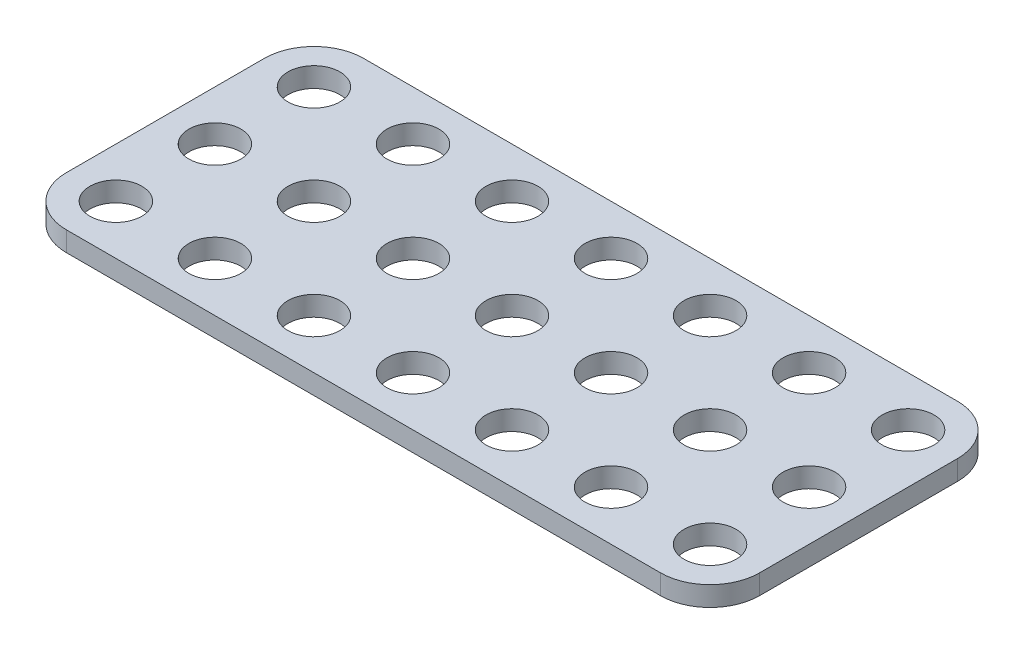
ISO-10303-21;
HEADER;
FILE_DESCRIPTION(('STEP AP214'),'2;1');
FILE_NAME('part.step','',(''),(''),'','','');
FILE_SCHEMA(('AUTOMOTIVE_DESIGN { 1 0 10303 214 1 1 1 1 }'));
ENDSEC;
DATA;
#1=APPLICATION_CONTEXT('core data for automotive mechanical design processes');
#2=APPLICATION_PROTOCOL_DEFINITION('international standard','automotive_design',2000,#1);
#3=PRODUCT_CONTEXT('',#1,'mechanical');
#4=PRODUCT('Part','Part','',(#3));
#5=PRODUCT_RELATED_PRODUCT_CATEGORY('part','',(#4));
#6=PRODUCT_DEFINITION_FORMATION('','',#4);
#7=PRODUCT_DEFINITION_CONTEXT('part definition',#1,'design');
#8=PRODUCT_DEFINITION('design','',#6,#7);
#9=PRODUCT_DEFINITION_SHAPE('','',#8);
#10=(LENGTH_UNIT() NAMED_UNIT(*) SI_UNIT(.MILLI.,.METRE.));
#11=(NAMED_UNIT(*) PLANE_ANGLE_UNIT() SI_UNIT($,.RADIAN.));
#12=(NAMED_UNIT(*) SI_UNIT($,.STERADIAN.) SOLID_ANGLE_UNIT());
#13=UNCERTAINTY_MEASURE_WITH_UNIT(LENGTH_MEASURE(1.E-05),#10,'distance_accuracy_value','');
#14=(GEOMETRIC_REPRESENTATION_CONTEXT(3) GLOBAL_UNCERTAINTY_ASSIGNED_CONTEXT((#13)) GLOBAL_UNIT_ASSIGNED_CONTEXT((#10,
#11,#12)) REPRESENTATION_CONTEXT('',''));
#15=CARTESIAN_POINT('',(0.,0.,0.));
#16=DIRECTION('',(0.,0.,1.));
#17=DIRECTION('',(1.,0.,0.));
#18=AXIS2_PLACEMENT_3D('',#15,#16,#17);
#19=CARTESIAN_POINT('',(0.,-1.6,-25.6));
#20=DIRECTION('',(0.,1.,0.));
#21=DIRECTION('',(0.,0.,1.));
#22=AXIS2_PLACEMENT_3D('',#19,#20,#21);
#23=PLANE('',#22);
#24=CARTESIAN_POINT('',(-44.8,-1.6,-4.79999999999999));
#25=DIRECTION('',(0.,1.,0.));
#26=DIRECTION('',(0.,0.,1.));
#27=AXIS2_PLACEMENT_3D('',#24,#25,#26);
#28=CIRCLE('',#27,2.09999999999999);
#29=CARTESIAN_POINT('',(-44.8,-1.6,-2.7));
#30=VERTEX_POINT('',#29);
#31=EDGE_CURVE('E112',#30,#30,#28,.T.);
#32=ORIENTED_EDGE('',*,*,#31,.T.);
#33=EDGE_LOOP('',(#32));
#34=FACE_BOUND('',#33,.T.);
#35=CARTESIAN_POINT('',(-52.8,-1.6,-4.79999999999999));
#36=DIRECTION('',(0.,1.,0.));
#37=DIRECTION('',(0.,0.,1.));
#38=AXIS2_PLACEMENT_3D('',#35,#36,#37);
#39=CIRCLE('',#38,2.09999999999999);
#40=CARTESIAN_POINT('',(-52.8,-1.6,-2.7));
#41=VERTEX_POINT('',#40);
#42=EDGE_CURVE('E202',#41,#41,#39,.T.);
#43=ORIENTED_EDGE('',*,*,#42,.T.);
#44=EDGE_LOOP('',(#43));
#45=FACE_BOUND('',#44,.T.);
#46=DIRECTION('',(-1.,0.,0.));
#47=VECTOR('',#46,1.);
#48=CARTESIAN_POINT('',(-56.8,-1.6,-0.8));
#49=LINE('',#48,#47);
#50=CARTESIAN_POINT('',(-4.80000000000001,-1.6,-0.799999999999999));
#51=VERTEX_POINT('',#50);
#52=CARTESIAN_POINT('',(-52.8,-1.6,-0.8));
#53=VERTEX_POINT('',#52);
#54=EDGE_CURVE('E82',#51,#53,#49,.T.);
#55=ORIENTED_EDGE('',*,*,#54,.T.);
#56=CARTESIAN_POINT('',(-52.8,-1.6,-4.8));
#57=DIRECTION('',(0.,1.,0.));
#58=DIRECTION('',(0.,0.,1.));
#59=AXIS2_PLACEMENT_3D('',#56,#57,#58);
#60=CIRCLE('',#59,4.);
#61=CARTESIAN_POINT('',(-56.8,-1.6,-4.8));
#62=VERTEX_POINT('',#61);
#63=EDGE_CURVE('E85',#62,#53,#60,.T.);
#64=ORIENTED_EDGE('',*,*,#63,.F.);
#65=DIRECTION('',(0.,0.,-1.));
#66=VECTOR('',#65,1.);
#67=CARTESIAN_POINT('',(-56.8,-1.6,0.));
#68=LINE('',#67,#66);
#69=CARTESIAN_POINT('',(-56.8,-1.6,-20.8));
#70=VERTEX_POINT('',#69);
#71=EDGE_CURVE('E77',#62,#70,#68,.T.);
#72=ORIENTED_EDGE('',*,*,#71,.T.);
#73=CARTESIAN_POINT('',(-52.8,-1.6,-20.8));
#74=DIRECTION('',(0.,1.,0.));
#75=DIRECTION('',(0.,0.,1.));
#76=AXIS2_PLACEMENT_3D('',#73,#74,#75);
#77=CIRCLE('',#76,4.);
#78=CARTESIAN_POINT('',(-52.8,-1.6,-24.8));
#79=VERTEX_POINT('',#78);
#80=EDGE_CURVE('E194',#79,#70,#77,.T.);
#81=ORIENTED_EDGE('',*,*,#80,.F.);
#82=DIRECTION('',(1.,0.,0.));
#83=VECTOR('',#82,1.);
#84=CARTESIAN_POINT('',(-56.8,-1.6,-24.8));
#85=LINE('',#84,#83);
#86=CARTESIAN_POINT('',(-4.8,-1.6,-24.8));
#87=VERTEX_POINT('',#86);
#88=EDGE_CURVE('E113',#79,#87,#85,.T.);
#89=ORIENTED_EDGE('',*,*,#88,.T.);
#90=CARTESIAN_POINT('',(-4.8,-1.6,-20.8));
#91=DIRECTION('',(0.,1.,0.));
#92=DIRECTION('',(0.,0.,1.));
#93=AXIS2_PLACEMENT_3D('',#90,#91,#92);
#94=CIRCLE('',#93,4.);
#95=CARTESIAN_POINT('',(-0.8,-1.6,-20.8));
#96=VERTEX_POINT('',#95);
#97=EDGE_CURVE('E116',#96,#87,#94,.T.);
#98=ORIENTED_EDGE('',*,*,#97,.F.);
#99=DIRECTION('',(0.,0.,1.));
#100=VECTOR('',#99,1.);
#101=CARTESIAN_POINT('',(-0.8,-1.6,-25.6));
#102=LINE('',#101,#100);
#103=CARTESIAN_POINT('',(-0.800000000000002,-1.6,-4.8));
#104=VERTEX_POINT('',#103);
#105=EDGE_CURVE('E117',#96,#104,#102,.T.);
#106=ORIENTED_EDGE('',*,*,#105,.T.);
#107=CARTESIAN_POINT('',(-4.8,-1.6,-4.8));
#108=DIRECTION('',(0.,-1.,0.));
#109=DIRECTION('',(0.,0.,-1.));
#110=AXIS2_PLACEMENT_3D('',#107,#108,#109);
#111=CIRCLE('',#110,4.);
#112=EDGE_CURVE('E88',#51,#104,#111,.F.);
#113=ORIENTED_EDGE('',*,*,#112,.F.);
#114=EDGE_LOOP('',(#55,#64,#72,#81,#89,#98,#106,#113));
#115=FACE_BOUND('',#114,.T.);
#116=CARTESIAN_POINT('',(-36.8,-1.6,-4.79999999999999));
#117=DIRECTION('',(0.,1.,0.));
#118=DIRECTION('',(0.,0.,1.));
#119=AXIS2_PLACEMENT_3D('',#116,#117,#118);
#120=CIRCLE('',#119,2.09999999999999);
#121=CARTESIAN_POINT('',(-36.8,-1.6,-2.7));
#122=VERTEX_POINT('',#121);
#123=EDGE_CURVE('E205',#122,#122,#120,.T.);
#124=ORIENTED_EDGE('',*,*,#123,.T.);
#125=EDGE_LOOP('',(#124));
#126=FACE_BOUND('',#125,.T.);
#127=CARTESIAN_POINT('',(-28.8,-1.6,-4.8));
#128=DIRECTION('',(0.,1.,0.));
#129=DIRECTION('',(0.,0.,1.));
#130=AXIS2_PLACEMENT_3D('',#127,#128,#129);
#131=CIRCLE('',#130,2.09999999999999);
#132=CARTESIAN_POINT('',(-28.8,-1.6,-2.70000000000001));
#133=VERTEX_POINT('',#132);
#134=EDGE_CURVE('E208',#133,#133,#131,.T.);
#135=ORIENTED_EDGE('',*,*,#134,.T.);
#136=EDGE_LOOP('',(#135));
#137=FACE_BOUND('',#136,.T.);
#138=CARTESIAN_POINT('',(-20.8,-1.6,-4.8));
#139=DIRECTION('',(0.,1.,0.));
#140=DIRECTION('',(0.,0.,1.));
#141=AXIS2_PLACEMENT_3D('',#138,#139,#140);
#142=CIRCLE('',#141,2.09999999999999);
#143=CARTESIAN_POINT('',(-20.8,-1.6,-2.70000000000001));
#144=VERTEX_POINT('',#143);
#145=EDGE_CURVE('E211',#144,#144,#142,.T.);
#146=ORIENTED_EDGE('',*,*,#145,.T.);
#147=EDGE_LOOP('',(#146));
#148=FACE_BOUND('',#147,.T.);
#149=CARTESIAN_POINT('',(-12.8,-1.6,-4.8));
#150=DIRECTION('',(0.,1.,0.));
#151=DIRECTION('',(0.,0.,1.));
#152=AXIS2_PLACEMENT_3D('',#149,#150,#151);
#153=CIRCLE('',#152,2.09999999999999);
#154=CARTESIAN_POINT('',(-12.8,-1.6,-2.70000000000001));
#155=VERTEX_POINT('',#154);
#156=EDGE_CURVE('E214',#155,#155,#153,.T.);
#157=ORIENTED_EDGE('',*,*,#156,.T.);
#158=EDGE_LOOP('',(#157));
#159=FACE_BOUND('',#158,.T.);
#160=CARTESIAN_POINT('',(-4.8,-1.6,-4.8));
#161=DIRECTION('',(0.,1.,0.));
#162=DIRECTION('',(0.,0.,1.));
#163=AXIS2_PLACEMENT_3D('',#160,#161,#162);
#164=CIRCLE('',#163,2.09999999999999);
#165=CARTESIAN_POINT('',(-4.8,-1.6,-2.70000000000001));
#166=VERTEX_POINT('',#165);
#167=EDGE_CURVE('E217',#166,#166,#164,.T.);
#168=ORIENTED_EDGE('',*,*,#167,.T.);
#169=EDGE_LOOP('',(#168));
#170=FACE_BOUND('',#169,.T.);
#171=CARTESIAN_POINT('',(-52.8,-1.6,-12.8));
#172=DIRECTION('',(0.,1.,0.));
#173=DIRECTION('',(0.,0.,1.));
#174=AXIS2_PLACEMENT_3D('',#171,#172,#173);
#175=CIRCLE('',#174,2.09999999999999);
#176=CARTESIAN_POINT('',(-52.8,-1.6,-10.7));
#177=VERTEX_POINT('',#176);
#178=EDGE_CURVE('E220',#177,#177,#175,.T.);
#179=ORIENTED_EDGE('',*,*,#178,.T.);
#180=EDGE_LOOP('',(#179));
#181=FACE_BOUND('',#180,.T.);
#182=CARTESIAN_POINT('',(-44.8,-1.6,-12.8));
#183=DIRECTION('',(0.,1.,0.));
#184=DIRECTION('',(0.,0.,1.));
#185=AXIS2_PLACEMENT_3D('',#182,#183,#184);
#186=CIRCLE('',#185,2.09999999999999);
#187=CARTESIAN_POINT('',(-44.8,-1.6,-10.7));
#188=VERTEX_POINT('',#187);
#189=EDGE_CURVE('E223',#188,#188,#186,.T.);
#190=ORIENTED_EDGE('',*,*,#189,.T.);
#191=EDGE_LOOP('',(#190));
#192=FACE_BOUND('',#191,.T.);
#193=CARTESIAN_POINT('',(-36.8,-1.6,-12.8));
#194=DIRECTION('',(0.,1.,0.));
#195=DIRECTION('',(0.,0.,1.));
#196=AXIS2_PLACEMENT_3D('',#193,#194,#195);
#197=CIRCLE('',#196,2.09999999999999);
#198=CARTESIAN_POINT('',(-36.8,-1.6,-10.7));
#199=VERTEX_POINT('',#198);
#200=EDGE_CURVE('E226',#199,#199,#197,.T.);
#201=ORIENTED_EDGE('',*,*,#200,.T.);
#202=EDGE_LOOP('',(#201));
#203=FACE_BOUND('',#202,.T.);
#204=CARTESIAN_POINT('',(-28.8,-1.6,-12.8));
#205=DIRECTION('',(0.,1.,0.));
#206=DIRECTION('',(0.,0.,1.));
#207=AXIS2_PLACEMENT_3D('',#204,#205,#206);
#208=CIRCLE('',#207,2.09999999999999);
#209=CARTESIAN_POINT('',(-28.8,-1.6,-10.7));
#210=VERTEX_POINT('',#209);
#211=EDGE_CURVE('E229',#210,#210,#208,.T.);
#212=ORIENTED_EDGE('',*,*,#211,.T.);
#213=EDGE_LOOP('',(#212));
#214=FACE_BOUND('',#213,.T.);
#215=CARTESIAN_POINT('',(-20.8,-1.6,-12.8));
#216=DIRECTION('',(0.,1.,0.));
#217=DIRECTION('',(0.,0.,1.));
#218=AXIS2_PLACEMENT_3D('',#215,#216,#217);
#219=CIRCLE('',#218,2.09999999999999);
#220=CARTESIAN_POINT('',(-20.8,-1.6,-10.7));
#221=VERTEX_POINT('',#220);
#222=EDGE_CURVE('E232',#221,#221,#219,.T.);
#223=ORIENTED_EDGE('',*,*,#222,.T.);
#224=EDGE_LOOP('',(#223));
#225=FACE_BOUND('',#224,.T.);
#226=CARTESIAN_POINT('',(-12.8,-1.6,-12.8));
#227=DIRECTION('',(0.,1.,0.));
#228=DIRECTION('',(0.,0.,1.));
#229=AXIS2_PLACEMENT_3D('',#226,#227,#228);
#230=CIRCLE('',#229,2.09999999999999);
#231=CARTESIAN_POINT('',(-12.8,-1.6,-10.7));
#232=VERTEX_POINT('',#231);
#233=EDGE_CURVE('E235',#232,#232,#230,.T.);
#234=ORIENTED_EDGE('',*,*,#233,.T.);
#235=EDGE_LOOP('',(#234));
#236=FACE_BOUND('',#235,.T.);
#237=CARTESIAN_POINT('',(-4.8,-1.6,-12.8));
#238=DIRECTION('',(0.,1.,0.));
#239=DIRECTION('',(0.,0.,1.));
#240=AXIS2_PLACEMENT_3D('',#237,#238,#239);
#241=CIRCLE('',#240,2.09999999999999);
#242=CARTESIAN_POINT('',(-4.8,-1.6,-10.7));
#243=VERTEX_POINT('',#242);
#244=EDGE_CURVE('E238',#243,#243,#241,.T.);
#245=ORIENTED_EDGE('',*,*,#244,.T.);
#246=EDGE_LOOP('',(#245));
#247=FACE_BOUND('',#246,.T.);
#248=CARTESIAN_POINT('',(-52.8,-1.6,-20.8));
#249=DIRECTION('',(0.,1.,0.));
#250=DIRECTION('',(0.,0.,1.));
#251=AXIS2_PLACEMENT_3D('',#248,#249,#250);
#252=CIRCLE('',#251,2.09999999999999);
#253=CARTESIAN_POINT('',(-52.8,-1.6,-18.7));
#254=VERTEX_POINT('',#253);
#255=EDGE_CURVE('E241',#254,#254,#252,.T.);
#256=ORIENTED_EDGE('',*,*,#255,.T.);
#257=EDGE_LOOP('',(#256));
#258=FACE_BOUND('',#257,.T.);
#259=CARTESIAN_POINT('',(-44.8,-1.6,-20.8));
#260=DIRECTION('',(0.,1.,0.));
#261=DIRECTION('',(0.,0.,1.));
#262=AXIS2_PLACEMENT_3D('',#259,#260,#261);
#263=CIRCLE('',#262,2.09999999999999);
#264=CARTESIAN_POINT('',(-44.8,-1.6,-18.7));
#265=VERTEX_POINT('',#264);
#266=EDGE_CURVE('E244',#265,#265,#263,.T.);
#267=ORIENTED_EDGE('',*,*,#266,.T.);
#268=EDGE_LOOP('',(#267));
#269=FACE_BOUND('',#268,.T.);
#270=CARTESIAN_POINT('',(-36.8,-1.6,-20.8));
#271=DIRECTION('',(0.,1.,0.));
#272=DIRECTION('',(0.,0.,1.));
#273=AXIS2_PLACEMENT_3D('',#270,#271,#272);
#274=CIRCLE('',#273,2.09999999999999);
#275=CARTESIAN_POINT('',(-36.8,-1.6,-18.7));
#276=VERTEX_POINT('',#275);
#277=EDGE_CURVE('E247',#276,#276,#274,.T.);
#278=ORIENTED_EDGE('',*,*,#277,.T.);
#279=EDGE_LOOP('',(#278));
#280=FACE_BOUND('',#279,.T.);
#281=CARTESIAN_POINT('',(-28.8,-1.6,-20.8));
#282=DIRECTION('',(0.,1.,0.));
#283=DIRECTION('',(0.,0.,1.));
#284=AXIS2_PLACEMENT_3D('',#281,#282,#283);
#285=CIRCLE('',#284,2.09999999999999);
#286=CARTESIAN_POINT('',(-28.8,-1.6,-18.7));
#287=VERTEX_POINT('',#286);
#288=EDGE_CURVE('E250',#287,#287,#285,.T.);
#289=ORIENTED_EDGE('',*,*,#288,.T.);
#290=EDGE_LOOP('',(#289));
#291=FACE_BOUND('',#290,.T.);
#292=CARTESIAN_POINT('',(-20.8,-1.6,-20.8));
#293=DIRECTION('',(0.,1.,0.));
#294=DIRECTION('',(0.,0.,1.));
#295=AXIS2_PLACEMENT_3D('',#292,#293,#294);
#296=CIRCLE('',#295,2.09999999999999);
#297=CARTESIAN_POINT('',(-20.8,-1.6,-18.7));
#298=VERTEX_POINT('',#297);
#299=EDGE_CURVE('E253',#298,#298,#296,.T.);
#300=ORIENTED_EDGE('',*,*,#299,.T.);
#301=EDGE_LOOP('',(#300));
#302=FACE_BOUND('',#301,.T.);
#303=CARTESIAN_POINT('',(-12.8,-1.6,-20.8));
#304=DIRECTION('',(0.,1.,0.));
#305=DIRECTION('',(0.,0.,1.));
#306=AXIS2_PLACEMENT_3D('',#303,#304,#305);
#307=CIRCLE('',#306,2.09999999999999);
#308=CARTESIAN_POINT('',(-12.8,-1.6,-18.7));
#309=VERTEX_POINT('',#308);
#310=EDGE_CURVE('E255',#309,#309,#307,.T.);
#311=ORIENTED_EDGE('',*,*,#310,.T.);
#312=EDGE_LOOP('',(#311));
#313=FACE_BOUND('',#312,.T.);
#314=CARTESIAN_POINT('',(-4.8,-1.6,-20.8));
#315=DIRECTION('',(0.,1.,0.));
#316=DIRECTION('',(0.,0.,1.));
#317=AXIS2_PLACEMENT_3D('',#314,#315,#316);
#318=CIRCLE('',#317,2.09999999999999);
#319=CARTESIAN_POINT('',(-4.8,-1.6,-18.7));
#320=VERTEX_POINT('',#319);
#321=EDGE_CURVE('E19',#320,#320,#318,.T.);
#322=ORIENTED_EDGE('',*,*,#321,.T.);
#323=EDGE_LOOP('',(#322));
#324=FACE_BOUND('',#323,.T.);
#325=ADVANCED_FACE('F16',(#34,#45,#115,#126,#137,#148,#159,#170,#181,#192,#203,#214,#225,#236,
#247,#258,#269,#280,#291,#302,#313,#324),#23,.F.);
#326=CARTESIAN_POINT('',(-4.8,-10.,-20.8));
#327=DIRECTION('',(0.,1.,0.));
#328=DIRECTION('',(0.,0.,1.));
#329=AXIS2_PLACEMENT_3D('',#326,#327,#328);
#330=CYLINDRICAL_SURFACE('',#329,2.09999999999999);
#331=ORIENTED_EDGE('',*,*,#321,.F.);
#332=EDGE_LOOP('',(#331));
#333=FACE_BOUND('',#332,.T.);
#334=CARTESIAN_POINT('',(-4.8,0.,-20.8));
#335=DIRECTION('',(0.,1.,0.));
#336=DIRECTION('',(0.,0.,1.));
#337=AXIS2_PLACEMENT_3D('',#334,#335,#336);
#338=CIRCLE('',#337,2.09999999999999);
#339=CARTESIAN_POINT('',(-4.8,0.,-18.7));
#340=VERTEX_POINT('',#339);
#341=EDGE_CURVE('E190',#340,#340,#338,.F.);
#342=ORIENTED_EDGE('',*,*,#341,.F.);
#343=EDGE_LOOP('',(#342));
#344=FACE_BOUND('',#343,.T.);
#345=ADVANCED_FACE('F263',(#333,#344),#330,.F.);
#346=CARTESIAN_POINT('',(-12.8,-10.,-20.8));
#347=DIRECTION('',(0.,1.,0.));
#348=DIRECTION('',(0.,0.,1.));
#349=AXIS2_PLACEMENT_3D('',#346,#347,#348);
#350=CYLINDRICAL_SURFACE('',#349,2.09999999999999);
#351=ORIENTED_EDGE('',*,*,#310,.F.);
#352=EDGE_LOOP('',(#351));
#353=FACE_BOUND('',#352,.T.);
#354=CARTESIAN_POINT('',(-12.8,0.,-20.8));
#355=DIRECTION('',(0.,1.,0.));
#356=DIRECTION('',(0.,0.,1.));
#357=AXIS2_PLACEMENT_3D('',#354,#355,#356);
#358=CIRCLE('',#357,2.09999999999999);
#359=CARTESIAN_POINT('',(-12.8,0.,-18.7));
#360=VERTEX_POINT('',#359);
#361=EDGE_CURVE('E187',#360,#360,#358,.F.);
#362=ORIENTED_EDGE('',*,*,#361,.F.);
#363=EDGE_LOOP('',(#362));
#364=FACE_BOUND('',#363,.T.);
#365=ADVANCED_FACE('F266',(#353,#364),#350,.F.);
#366=CARTESIAN_POINT('',(-20.8,-10.,-20.8));
#367=DIRECTION('',(0.,1.,0.));
#368=DIRECTION('',(0.,0.,1.));
#369=AXIS2_PLACEMENT_3D('',#366,#367,#368);
#370=CYLINDRICAL_SURFACE('',#369,2.09999999999999);
#371=ORIENTED_EDGE('',*,*,#299,.F.);
#372=EDGE_LOOP('',(#371));
#373=FACE_BOUND('',#372,.T.);
#374=CARTESIAN_POINT('',(-20.8,0.,-20.8));
#375=DIRECTION('',(0.,1.,0.));
#376=DIRECTION('',(0.,0.,1.));
#377=AXIS2_PLACEMENT_3D('',#374,#375,#376);
#378=CIRCLE('',#377,2.09999999999999);
#379=CARTESIAN_POINT('',(-20.8,0.,-18.7));
#380=VERTEX_POINT('',#379);
#381=EDGE_CURVE('E184',#380,#380,#378,.F.);
#382=ORIENTED_EDGE('',*,*,#381,.F.);
#383=EDGE_LOOP('',(#382));
#384=FACE_BOUND('',#383,.T.);
#385=ADVANCED_FACE('F376',(#373,#384),#370,.F.);
#386=CARTESIAN_POINT('',(-28.8,-10.,-20.8));
#387=DIRECTION('',(0.,1.,0.));
#388=DIRECTION('',(0.,0.,1.));
#389=AXIS2_PLACEMENT_3D('',#386,#387,#388);
#390=CYLINDRICAL_SURFACE('',#389,2.09999999999999);
#391=ORIENTED_EDGE('',*,*,#288,.F.);
#392=EDGE_LOOP('',(#391));
#393=FACE_BOUND('',#392,.T.);
#394=CARTESIAN_POINT('',(-28.8,0.,-20.8));
#395=DIRECTION('',(0.,1.,0.));
#396=DIRECTION('',(0.,0.,1.));
#397=AXIS2_PLACEMENT_3D('',#394,#395,#396);
#398=CIRCLE('',#397,2.09999999999999);
#399=CARTESIAN_POINT('',(-28.8,0.,-18.7));
#400=VERTEX_POINT('',#399);
#401=EDGE_CURVE('E181',#400,#400,#398,.F.);
#402=ORIENTED_EDGE('',*,*,#401,.F.);
#403=EDGE_LOOP('',(#402));
#404=FACE_BOUND('',#403,.T.);
#405=ADVANCED_FACE('F372',(#393,#404),#390,.F.);
#406=CARTESIAN_POINT('',(-36.8,-10.,-20.8));
#407=DIRECTION('',(0.,1.,0.));
#408=DIRECTION('',(0.,0.,1.));
#409=AXIS2_PLACEMENT_3D('',#406,#407,#408);
#410=CYLINDRICAL_SURFACE('',#409,2.09999999999999);
#411=ORIENTED_EDGE('',*,*,#277,.F.);
#412=EDGE_LOOP('',(#411));
#413=FACE_BOUND('',#412,.T.);
#414=CARTESIAN_POINT('',(-36.8,0.,-20.8));
#415=DIRECTION('',(0.,1.,0.));
#416=DIRECTION('',(0.,0.,1.));
#417=AXIS2_PLACEMENT_3D('',#414,#415,#416);
#418=CIRCLE('',#417,2.09999999999999);
#419=CARTESIAN_POINT('',(-36.8,0.,-18.7));
#420=VERTEX_POINT('',#419);
#421=EDGE_CURVE('E178',#420,#420,#418,.F.);
#422=ORIENTED_EDGE('',*,*,#421,.F.);
#423=EDGE_LOOP('',(#422));
#424=FACE_BOUND('',#423,.T.);
#425=ADVANCED_FACE('F368',(#413,#424),#410,.F.);
#426=CARTESIAN_POINT('',(-44.8,-10.,-20.8));
#427=DIRECTION('',(0.,1.,0.));
#428=DIRECTION('',(0.,0.,1.));
#429=AXIS2_PLACEMENT_3D('',#426,#427,#428);
#430=CYLINDRICAL_SURFACE('',#429,2.09999999999999);
#431=ORIENTED_EDGE('',*,*,#266,.F.);
#432=EDGE_LOOP('',(#431));
#433=FACE_BOUND('',#432,.T.);
#434=CARTESIAN_POINT('',(-44.8,0.,-20.8));
#435=DIRECTION('',(0.,1.,0.));
#436=DIRECTION('',(0.,0.,1.));
#437=AXIS2_PLACEMENT_3D('',#434,#435,#436);
#438=CIRCLE('',#437,2.09999999999999);
#439=CARTESIAN_POINT('',(-44.8,0.,-18.7));
#440=VERTEX_POINT('',#439);
#441=EDGE_CURVE('E175',#440,#440,#438,.F.);
#442=ORIENTED_EDGE('',*,*,#441,.F.);
#443=EDGE_LOOP('',(#442));
#444=FACE_BOUND('',#443,.T.);
#445=ADVANCED_FACE('F364',(#433,#444),#430,.F.);
#446=CARTESIAN_POINT('',(-52.8,-10.,-20.8));
#447=DIRECTION('',(0.,1.,0.));
#448=DIRECTION('',(0.,0.,1.));
#449=AXIS2_PLACEMENT_3D('',#446,#447,#448);
#450=CYLINDRICAL_SURFACE('',#449,2.09999999999999);
#451=ORIENTED_EDGE('',*,*,#255,.F.);
#452=EDGE_LOOP('',(#451));
#453=FACE_BOUND('',#452,.T.);
#454=CARTESIAN_POINT('',(-52.8,0.,-20.8));
#455=DIRECTION('',(0.,1.,0.));
#456=DIRECTION('',(0.,0.,1.));
#457=AXIS2_PLACEMENT_3D('',#454,#455,#456);
#458=CIRCLE('',#457,2.09999999999999);
#459=CARTESIAN_POINT('',(-52.8,0.,-18.7));
#460=VERTEX_POINT('',#459);
#461=EDGE_CURVE('E172',#460,#460,#458,.F.);
#462=ORIENTED_EDGE('',*,*,#461,.F.);
#463=EDGE_LOOP('',(#462));
#464=FACE_BOUND('',#463,.T.);
#465=ADVANCED_FACE('F360',(#453,#464),#450,.F.);
#466=CARTESIAN_POINT('',(-4.8,-10.,-12.8));
#467=DIRECTION('',(0.,1.,0.));
#468=DIRECTION('',(0.,0.,1.));
#469=AXIS2_PLACEMENT_3D('',#466,#467,#468);
#470=CYLINDRICAL_SURFACE('',#469,2.09999999999999);
#471=ORIENTED_EDGE('',*,*,#244,.F.);
#472=EDGE_LOOP('',(#471));
#473=FACE_BOUND('',#472,.T.);
#474=CARTESIAN_POINT('',(-4.8,0.,-12.8));
#475=DIRECTION('',(0.,1.,0.));
#476=DIRECTION('',(0.,0.,1.));
#477=AXIS2_PLACEMENT_3D('',#474,#475,#476);
#478=CIRCLE('',#477,2.09999999999999);
#479=CARTESIAN_POINT('',(-4.8,0.,-10.7));
#480=VERTEX_POINT('',#479);
#481=EDGE_CURVE('E169',#480,#480,#478,.F.);
#482=ORIENTED_EDGE('',*,*,#481,.F.);
#483=EDGE_LOOP('',(#482));
#484=FACE_BOUND('',#483,.T.);
#485=ADVANCED_FACE('F356',(#473,#484),#470,.F.);
#486=CARTESIAN_POINT('',(-12.8,-10.,-12.8));
#487=DIRECTION('',(0.,1.,0.));
#488=DIRECTION('',(0.,0.,1.));
#489=AXIS2_PLACEMENT_3D('',#486,#487,#488);
#490=CYLINDRICAL_SURFACE('',#489,2.09999999999999);
#491=ORIENTED_EDGE('',*,*,#233,.F.);
#492=EDGE_LOOP('',(#491));
#493=FACE_BOUND('',#492,.T.);
#494=CARTESIAN_POINT('',(-12.8,0.,-12.8));
#495=DIRECTION('',(0.,1.,0.));
#496=DIRECTION('',(0.,0.,1.));
#497=AXIS2_PLACEMENT_3D('',#494,#495,#496);
#498=CIRCLE('',#497,2.09999999999999);
#499=CARTESIAN_POINT('',(-12.8,0.,-10.7));
#500=VERTEX_POINT('',#499);
#501=EDGE_CURVE('E166',#500,#500,#498,.F.);
#502=ORIENTED_EDGE('',*,*,#501,.F.);
#503=EDGE_LOOP('',(#502));
#504=FACE_BOUND('',#503,.T.);
#505=ADVANCED_FACE('F352',(#493,#504),#490,.F.);
#506=CARTESIAN_POINT('',(-20.8,-10.,-12.8));
#507=DIRECTION('',(0.,1.,0.));
#508=DIRECTION('',(0.,0.,1.));
#509=AXIS2_PLACEMENT_3D('',#506,#507,#508);
#510=CYLINDRICAL_SURFACE('',#509,2.09999999999999);
#511=ORIENTED_EDGE('',*,*,#222,.F.);
#512=EDGE_LOOP('',(#511));
#513=FACE_BOUND('',#512,.T.);
#514=CARTESIAN_POINT('',(-20.8,0.,-12.8));
#515=DIRECTION('',(0.,1.,0.));
#516=DIRECTION('',(0.,0.,1.));
#517=AXIS2_PLACEMENT_3D('',#514,#515,#516);
#518=CIRCLE('',#517,2.09999999999999);
#519=CARTESIAN_POINT('',(-20.8,0.,-10.7));
#520=VERTEX_POINT('',#519);
#521=EDGE_CURVE('E163',#520,#520,#518,.F.);
#522=ORIENTED_EDGE('',*,*,#521,.F.);
#523=EDGE_LOOP('',(#522));
#524=FACE_BOUND('',#523,.T.);
#525=ADVANCED_FACE('F348',(#513,#524),#510,.F.);
#526=CARTESIAN_POINT('',(-28.8,-10.,-12.8));
#527=DIRECTION('',(0.,1.,0.));
#528=DIRECTION('',(0.,0.,1.));
#529=AXIS2_PLACEMENT_3D('',#526,#527,#528);
#530=CYLINDRICAL_SURFACE('',#529,2.09999999999999);
#531=ORIENTED_EDGE('',*,*,#211,.F.);
#532=EDGE_LOOP('',(#531));
#533=FACE_BOUND('',#532,.T.);
#534=CARTESIAN_POINT('',(-28.8,0.,-12.8));
#535=DIRECTION('',(0.,1.,0.));
#536=DIRECTION('',(0.,0.,1.));
#537=AXIS2_PLACEMENT_3D('',#534,#535,#536);
#538=CIRCLE('',#537,2.09999999999999);
#539=CARTESIAN_POINT('',(-28.8,0.,-10.7));
#540=VERTEX_POINT('',#539);
#541=EDGE_CURVE('E160',#540,#540,#538,.F.);
#542=ORIENTED_EDGE('',*,*,#541,.F.);
#543=EDGE_LOOP('',(#542));
#544=FACE_BOUND('',#543,.T.);
#545=ADVANCED_FACE('F344',(#533,#544),#530,.F.);
#546=CARTESIAN_POINT('',(-36.8,-10.,-12.8));
#547=DIRECTION('',(0.,1.,0.));
#548=DIRECTION('',(0.,0.,1.));
#549=AXIS2_PLACEMENT_3D('',#546,#547,#548);
#550=CYLINDRICAL_SURFACE('',#549,2.09999999999999);
#551=ORIENTED_EDGE('',*,*,#200,.F.);
#552=EDGE_LOOP('',(#551));
#553=FACE_BOUND('',#552,.T.);
#554=CARTESIAN_POINT('',(-36.8,0.,-12.8));
#555=DIRECTION('',(0.,1.,0.));
#556=DIRECTION('',(0.,0.,1.));
#557=AXIS2_PLACEMENT_3D('',#554,#555,#556);
#558=CIRCLE('',#557,2.09999999999999);
#559=CARTESIAN_POINT('',(-36.8,0.,-10.7));
#560=VERTEX_POINT('',#559);
#561=EDGE_CURVE('E157',#560,#560,#558,.F.);
#562=ORIENTED_EDGE('',*,*,#561,.F.);
#563=EDGE_LOOP('',(#562));
#564=FACE_BOUND('',#563,.T.);
#565=ADVANCED_FACE('F340',(#553,#564),#550,.F.);
#566=CARTESIAN_POINT('',(-44.8,-10.,-12.8));
#567=DIRECTION('',(0.,1.,0.));
#568=DIRECTION('',(0.,0.,1.));
#569=AXIS2_PLACEMENT_3D('',#566,#567,#568);
#570=CYLINDRICAL_SURFACE('',#569,2.09999999999999);
#571=ORIENTED_EDGE('',*,*,#189,.F.);
#572=EDGE_LOOP('',(#571));
#573=FACE_BOUND('',#572,.T.);
#574=CARTESIAN_POINT('',(-44.8,0.,-12.8));
#575=DIRECTION('',(0.,1.,0.));
#576=DIRECTION('',(0.,0.,1.));
#577=AXIS2_PLACEMENT_3D('',#574,#575,#576);
#578=CIRCLE('',#577,2.09999999999999);
#579=CARTESIAN_POINT('',(-44.8,0.,-10.7));
#580=VERTEX_POINT('',#579);
#581=EDGE_CURVE('E154',#580,#580,#578,.F.);
#582=ORIENTED_EDGE('',*,*,#581,.F.);
#583=EDGE_LOOP('',(#582));
#584=FACE_BOUND('',#583,.T.);
#585=ADVANCED_FACE('F336',(#573,#584),#570,.F.);
#586=CARTESIAN_POINT('',(-52.8,-10.,-12.8));
#587=DIRECTION('',(0.,1.,0.));
#588=DIRECTION('',(0.,0.,1.));
#589=AXIS2_PLACEMENT_3D('',#586,#587,#588);
#590=CYLINDRICAL_SURFACE('',#589,2.09999999999999);
#591=ORIENTED_EDGE('',*,*,#178,.F.);
#592=EDGE_LOOP('',(#591));
#593=FACE_BOUND('',#592,.T.);
#594=CARTESIAN_POINT('',(-52.8,0.,-12.8));
#595=DIRECTION('',(0.,1.,0.));
#596=DIRECTION('',(0.,0.,1.));
#597=AXIS2_PLACEMENT_3D('',#594,#595,#596);
#598=CIRCLE('',#597,2.09999999999999);
#599=CARTESIAN_POINT('',(-52.8,0.,-10.7));
#600=VERTEX_POINT('',#599);
#601=EDGE_CURVE('E151',#600,#600,#598,.F.);
#602=ORIENTED_EDGE('',*,*,#601,.F.);
#603=EDGE_LOOP('',(#602));
#604=FACE_BOUND('',#603,.T.);
#605=ADVANCED_FACE('F332',(#593,#604),#590,.F.);
#606=CARTESIAN_POINT('',(-4.8,-10.,-4.8));
#607=DIRECTION('',(0.,1.,0.));
#608=DIRECTION('',(0.,0.,1.));
#609=AXIS2_PLACEMENT_3D('',#606,#607,#608);
#610=CYLINDRICAL_SURFACE('',#609,2.09999999999999);
#611=ORIENTED_EDGE('',*,*,#167,.F.);
#612=EDGE_LOOP('',(#611));
#613=FACE_BOUND('',#612,.T.);
#614=CARTESIAN_POINT('',(-4.8,0.,-4.8));
#615=DIRECTION('',(0.,1.,0.));
#616=DIRECTION('',(0.,0.,1.));
#617=AXIS2_PLACEMENT_3D('',#614,#615,#616);
#618=CIRCLE('',#617,2.09999999999999);
#619=CARTESIAN_POINT('',(-4.8,0.,-2.70000000000001));
#620=VERTEX_POINT('',#619);
#621=EDGE_CURVE('E148',#620,#620,#618,.F.);
#622=ORIENTED_EDGE('',*,*,#621,.F.);
#623=EDGE_LOOP('',(#622));
#624=FACE_BOUND('',#623,.T.);
#625=ADVANCED_FACE('F328',(#613,#624),#610,.F.);
#626=CARTESIAN_POINT('',(-12.8,-10.,-4.8));
#627=DIRECTION('',(0.,1.,0.));
#628=DIRECTION('',(0.,0.,1.));
#629=AXIS2_PLACEMENT_3D('',#626,#627,#628);
#630=CYLINDRICAL_SURFACE('',#629,2.09999999999999);
#631=ORIENTED_EDGE('',*,*,#156,.F.);
#632=EDGE_LOOP('',(#631));
#633=FACE_BOUND('',#632,.T.);
#634=CARTESIAN_POINT('',(-12.8,0.,-4.8));
#635=DIRECTION('',(0.,1.,0.));
#636=DIRECTION('',(0.,0.,1.));
#637=AXIS2_PLACEMENT_3D('',#634,#635,#636);
#638=CIRCLE('',#637,2.09999999999999);
#639=CARTESIAN_POINT('',(-12.8,0.,-2.70000000000001));
#640=VERTEX_POINT('',#639);
#641=EDGE_CURVE('E145',#640,#640,#638,.F.);
#642=ORIENTED_EDGE('',*,*,#641,.F.);
#643=EDGE_LOOP('',(#642));
#644=FACE_BOUND('',#643,.T.);
#645=ADVANCED_FACE('F324',(#633,#644),#630,.F.);
#646=CARTESIAN_POINT('',(-20.8,-10.,-4.8));
#647=DIRECTION('',(0.,1.,0.));
#648=DIRECTION('',(0.,0.,1.));
#649=AXIS2_PLACEMENT_3D('',#646,#647,#648);
#650=CYLINDRICAL_SURFACE('',#649,2.09999999999999);
#651=ORIENTED_EDGE('',*,*,#145,.F.);
#652=EDGE_LOOP('',(#651));
#653=FACE_BOUND('',#652,.T.);
#654=CARTESIAN_POINT('',(-20.8,0.,-4.8));
#655=DIRECTION('',(0.,1.,0.));
#656=DIRECTION('',(0.,0.,1.));
#657=AXIS2_PLACEMENT_3D('',#654,#655,#656);
#658=CIRCLE('',#657,2.09999999999999);
#659=CARTESIAN_POINT('',(-20.8,0.,-2.70000000000001));
#660=VERTEX_POINT('',#659);
#661=EDGE_CURVE('E142',#660,#660,#658,.F.);
#662=ORIENTED_EDGE('',*,*,#661,.F.);
#663=EDGE_LOOP('',(#662));
#664=FACE_BOUND('',#663,.T.);
#665=ADVANCED_FACE('F320',(#653,#664),#650,.F.);
#666=CARTESIAN_POINT('',(-28.8,-10.,-4.8));
#667=DIRECTION('',(0.,1.,0.));
#668=DIRECTION('',(0.,0.,1.));
#669=AXIS2_PLACEMENT_3D('',#666,#667,#668);
#670=CYLINDRICAL_SURFACE('',#669,2.09999999999999);
#671=ORIENTED_EDGE('',*,*,#134,.F.);
#672=EDGE_LOOP('',(#671));
#673=FACE_BOUND('',#672,.T.);
#674=CARTESIAN_POINT('',(-28.8,0.,-4.8));
#675=DIRECTION('',(0.,1.,0.));
#676=DIRECTION('',(0.,0.,1.));
#677=AXIS2_PLACEMENT_3D('',#674,#675,#676);
#678=CIRCLE('',#677,2.09999999999999);
#679=CARTESIAN_POINT('',(-28.8,0.,-2.70000000000001));
#680=VERTEX_POINT('',#679);
#681=EDGE_CURVE('E139',#680,#680,#678,.F.);
#682=ORIENTED_EDGE('',*,*,#681,.F.);
#683=EDGE_LOOP('',(#682));
#684=FACE_BOUND('',#683,.T.);
#685=ADVANCED_FACE('F316',(#673,#684),#670,.F.);
#686=CARTESIAN_POINT('',(-36.8,-10.,-4.79999999999999));
#687=DIRECTION('',(0.,1.,0.));
#688=DIRECTION('',(0.,0.,1.));
#689=AXIS2_PLACEMENT_3D('',#686,#687,#688);
#690=CYLINDRICAL_SURFACE('',#689,2.09999999999999);
#691=ORIENTED_EDGE('',*,*,#123,.F.);
#692=EDGE_LOOP('',(#691));
#693=FACE_BOUND('',#692,.T.);
#694=CARTESIAN_POINT('',(-36.8,0.,-4.79999999999999));
#695=DIRECTION('',(0.,1.,0.));
#696=DIRECTION('',(0.,0.,1.));
#697=AXIS2_PLACEMENT_3D('',#694,#695,#696);
#698=CIRCLE('',#697,2.09999999999999);
#699=CARTESIAN_POINT('',(-36.8,0.,-2.7));
#700=VERTEX_POINT('',#699);
#701=EDGE_CURVE('E136',#700,#700,#698,.F.);
#702=ORIENTED_EDGE('',*,*,#701,.F.);
#703=EDGE_LOOP('',(#702));
#704=FACE_BOUND('',#703,.T.);
#705=ADVANCED_FACE('F312',(#693,#704),#690,.F.);
#706=CARTESIAN_POINT('',(-52.8,-10.,-4.79999999999999));
#707=DIRECTION('',(0.,1.,0.));
#708=DIRECTION('',(0.,0.,1.));
#709=AXIS2_PLACEMENT_3D('',#706,#707,#708);
#710=CYLINDRICAL_SURFACE('',#709,2.09999999999999);
#711=ORIENTED_EDGE('',*,*,#42,.F.);
#712=EDGE_LOOP('',(#711));
#713=FACE_BOUND('',#712,.T.);
#714=CARTESIAN_POINT('',(-52.8,0.,-4.79999999999999));
#715=DIRECTION('',(0.,1.,0.));
#716=DIRECTION('',(0.,0.,1.));
#717=AXIS2_PLACEMENT_3D('',#714,#715,#716);
#718=CIRCLE('',#717,2.09999999999999);
#719=CARTESIAN_POINT('',(-52.8,0.,-2.7));
#720=VERTEX_POINT('',#719);
#721=EDGE_CURVE('E133',#720,#720,#718,.F.);
#722=ORIENTED_EDGE('',*,*,#721,.F.);
#723=EDGE_LOOP('',(#722));
#724=FACE_BOUND('',#723,.T.);
#725=ADVANCED_FACE('F308',(#713,#724),#710,.F.);
#726=CARTESIAN_POINT('',(-44.8,-10.,-4.79999999999999));
#727=DIRECTION('',(0.,1.,0.));
#728=DIRECTION('',(0.,0.,1.));
#729=AXIS2_PLACEMENT_3D('',#726,#727,#728);
#730=CYLINDRICAL_SURFACE('',#729,2.09999999999999);
#731=ORIENTED_EDGE('',*,*,#31,.F.);
#732=EDGE_LOOP('',(#731));
#733=FACE_BOUND('',#732,.T.);
#734=CARTESIAN_POINT('',(-44.8,0.,-4.79999999999999));
#735=DIRECTION('',(0.,1.,0.));
#736=DIRECTION('',(0.,0.,1.));
#737=AXIS2_PLACEMENT_3D('',#734,#735,#736);
#738=CIRCLE('',#737,2.09999999999999);
#739=CARTESIAN_POINT('',(-44.8,0.,-2.7));
#740=VERTEX_POINT('',#739);
#741=EDGE_CURVE('E130',#740,#740,#738,.F.);
#742=ORIENTED_EDGE('',*,*,#741,.F.);
#743=EDGE_LOOP('',(#742));
#744=FACE_BOUND('',#743,.T.);
#745=ADVANCED_FACE('F305',(#733,#744),#730,.F.);
#746=CARTESIAN_POINT('',(-56.8,-10.,0.));
#747=DIRECTION('',(1.,0.,0.));
#748=DIRECTION('',(0.,0.,-1.));
#749=AXIS2_PLACEMENT_3D('',#746,#747,#748);
#750=PLANE('',#749);
#751=ORIENTED_EDGE('',*,*,#71,.F.);
#752=DIRECTION('',(0.,1.,0.));
#753=VECTOR('',#752,1.);
#754=CARTESIAN_POINT('',(-56.8,-10.,-4.8));
#755=LINE('',#754,#753);
#756=CARTESIAN_POINT('',(-56.8,0.,-4.8));
#757=VERTEX_POINT('',#756);
#758=EDGE_CURVE('E98',#757,#62,#755,.F.);
#759=ORIENTED_EDGE('',*,*,#758,.F.);
#760=DIRECTION('',(0.,0.,1.));
#761=VECTOR('',#760,1.);
#762=CARTESIAN_POINT('',(-56.8,0.,-25.6));
#763=LINE('',#762,#761);
#764=CARTESIAN_POINT('',(-56.8,0.,-20.8));
#765=VERTEX_POINT('',#764);
#766=EDGE_CURVE('E129',#765,#757,#763,.T.);
#767=ORIENTED_EDGE('',*,*,#766,.F.);
#768=DIRECTION('',(0.,1.,0.));
#769=VECTOR('',#768,1.);
#770=CARTESIAN_POINT('',(-56.8,-10.,-20.8));
#771=LINE('',#770,#769);
#772=EDGE_CURVE('E193',#70,#765,#771,.T.);
#773=ORIENTED_EDGE('',*,*,#772,.F.);
#774=EDGE_LOOP('',(#751,#759,#767,#773));
#775=FACE_BOUND('',#774,.T.);
#776=ADVANCED_FACE('F302',(#775),#750,.F.);
#777=CARTESIAN_POINT('',(-52.8,-10.,-4.8));
#778=DIRECTION('',(0.,1.,0.));
#779=DIRECTION('',(0.,0.,1.));
#780=AXIS2_PLACEMENT_3D('',#777,#778,#779);
#781=CYLINDRICAL_SURFACE('',#780,4.);
#782=ORIENTED_EDGE('',*,*,#63,.T.);
#783=DIRECTION('',(0.,1.,0.));
#784=VECTOR('',#783,1.);
#785=CARTESIAN_POINT('',(-52.8,-10.,-0.8));
#786=LINE('',#785,#784);
#787=CARTESIAN_POINT('',(-52.8,0.,-0.799999999999999));
#788=VERTEX_POINT('',#787);
#789=EDGE_CURVE('E92',#53,#788,#786,.T.);
#790=ORIENTED_EDGE('',*,*,#789,.T.);
#791=CARTESIAN_POINT('',(-52.8,0.,-4.8));
#792=DIRECTION('',(0.,1.,0.));
#793=DIRECTION('',(0.,0.,1.));
#794=AXIS2_PLACEMENT_3D('',#791,#792,#793);
#795=CIRCLE('',#794,4.);
#796=EDGE_CURVE('E127',#757,#788,#795,.T.);
#797=ORIENTED_EDGE('',*,*,#796,.F.);
#798=ORIENTED_EDGE('',*,*,#758,.T.);
#799=EDGE_LOOP('',(#782,#790,#797,#798));
#800=FACE_BOUND('',#799,.T.);
#801=ADVANCED_FACE('F95',(#800),#781,.T.);
#802=CARTESIAN_POINT('',(-56.8,-10.,-0.8));
#803=DIRECTION('',(0.,0.,-1.));
#804=DIRECTION('',(-1.,0.,0.));
#805=AXIS2_PLACEMENT_3D('',#802,#803,#804);
#806=PLANE('',#805);
#807=DIRECTION('',(1.,0.,0.));
#808=VECTOR('',#807,1.);
#809=CARTESIAN_POINT('',(0.,0.,-0.799999999999999));
#810=LINE('',#809,#808);
#811=CARTESIAN_POINT('',(-4.80000000000001,0.,-0.799999999999999));
#812=VERTEX_POINT('',#811);
#813=EDGE_CURVE('E102',#788,#812,#810,.T.);
#814=ORIENTED_EDGE('',*,*,#813,.F.);
#815=ORIENTED_EDGE('',*,*,#789,.F.);
#816=ORIENTED_EDGE('',*,*,#54,.F.);
#817=DIRECTION('',(0.,-1.,0.));
#818=VECTOR('',#817,1.);
#819=CARTESIAN_POINT('',(-4.80000000000001,-10.,-0.799999999999999));
#820=LINE('',#819,#818);
#821=EDGE_CURVE('E105',#812,#51,#820,.T.);
#822=ORIENTED_EDGE('',*,*,#821,.F.);
#823=EDGE_LOOP('',(#814,#815,#816,#822));
#824=FACE_BOUND('',#823,.T.);
#825=ADVANCED_FACE('F100',(#824),#806,.F.);
#826=CARTESIAN_POINT('',(-4.8,-10.,-4.8));
#827=DIRECTION('',(0.,-1.,0.));
#828=DIRECTION('',(0.,0.,-1.));
#829=AXIS2_PLACEMENT_3D('',#826,#827,#828);
#830=CYLINDRICAL_SURFACE('',#829,4.);
#831=CARTESIAN_POINT('',(-4.8,0.,-4.8));
#832=DIRECTION('',(0.,-1.,0.));
#833=DIRECTION('',(0.,0.,-1.));
#834=AXIS2_PLACEMENT_3D('',#831,#832,#833);
#835=CIRCLE('',#834,4.);
#836=CARTESIAN_POINT('',(-0.800000000000002,0.,-4.8));
#837=VERTEX_POINT('',#836);
#838=EDGE_CURVE('E124',#812,#837,#835,.F.);
#839=ORIENTED_EDGE('',*,*,#838,.F.);
#840=ORIENTED_EDGE('',*,*,#821,.T.);
#841=ORIENTED_EDGE('',*,*,#112,.T.);
#842=DIRECTION('',(0.,1.,0.));
#843=VECTOR('',#842,1.);
#844=CARTESIAN_POINT('',(-0.800000000000002,-10.,-4.8));
#845=LINE('',#844,#843);
#846=EDGE_CURVE('E118',#104,#837,#845,.T.);
#847=ORIENTED_EDGE('',*,*,#846,.T.);
#848=EDGE_LOOP('',(#839,#840,#841,#847));
#849=FACE_BOUND('',#848,.T.);
#850=ADVANCED_FACE('F293',(#849),#830,.T.);
#851=CARTESIAN_POINT('',(-0.8,-10.,-25.6));
#852=DIRECTION('',(-1.,0.,0.));
#853=DIRECTION('',(0.,0.,1.));
#854=AXIS2_PLACEMENT_3D('',#851,#852,#853);
#855=PLANE('',#854);
#856=ORIENTED_EDGE('',*,*,#105,.F.);
#857=DIRECTION('',(0.,1.,0.));
#858=VECTOR('',#857,1.);
#859=CARTESIAN_POINT('',(-0.8,-10.,-20.8));
#860=LINE('',#859,#858);
#861=CARTESIAN_POINT('',(-0.800000000000001,0.,-20.8));
#862=VERTEX_POINT('',#861);
#863=EDGE_CURVE('E198',#862,#96,#860,.F.);
#864=ORIENTED_EDGE('',*,*,#863,.F.);
#865=DIRECTION('',(0.,0.,1.));
#866=VECTOR('',#865,1.);
#867=CARTESIAN_POINT('',(-0.800000000000002,0.,-25.6));
#868=LINE('',#867,#866);
#869=EDGE_CURVE('E123',#837,#862,#868,.F.);
#870=ORIENTED_EDGE('',*,*,#869,.F.);
#871=ORIENTED_EDGE('',*,*,#846,.F.);
#872=EDGE_LOOP('',(#856,#864,#870,#871));
#873=FACE_BOUND('',#872,.T.);
#874=ADVANCED_FACE('F289',(#873),#855,.F.);
#875=CARTESIAN_POINT('',(-4.8,-10.,-20.8));
#876=DIRECTION('',(0.,1.,0.));
#877=DIRECTION('',(0.,0.,1.));
#878=AXIS2_PLACEMENT_3D('',#875,#876,#877);
#879=CYLINDRICAL_SURFACE('',#878,4.);
#880=ORIENTED_EDGE('',*,*,#97,.T.);
#881=DIRECTION('',(0.,1.,0.));
#882=VECTOR('',#881,1.);
#883=CARTESIAN_POINT('',(-4.8,-10.,-24.8));
#884=LINE('',#883,#882);
#885=CARTESIAN_POINT('',(-4.8,0.,-24.8));
#886=VERTEX_POINT('',#885);
#887=EDGE_CURVE('E115',#87,#886,#884,.T.);
#888=ORIENTED_EDGE('',*,*,#887,.T.);
#889=CARTESIAN_POINT('',(-4.8,0.,-20.8));
#890=DIRECTION('',(0.,1.,0.));
#891=DIRECTION('',(0.,0.,1.));
#892=AXIS2_PLACEMENT_3D('',#889,#890,#891);
#893=CIRCLE('',#892,4.);
#894=EDGE_CURVE('E120',#862,#886,#893,.T.);
#895=ORIENTED_EDGE('',*,*,#894,.F.);
#896=ORIENTED_EDGE('',*,*,#863,.T.);
#897=EDGE_LOOP('',(#880,#888,#895,#896));
#898=FACE_BOUND('',#897,.T.);
#899=ADVANCED_FACE('F286',(#898),#879,.T.);
#900=CARTESIAN_POINT('',(-56.8,-10.,-24.8));
#901=DIRECTION('',(0.,0.,1.));
#902=DIRECTION('',(1.,0.,0.));
#903=AXIS2_PLACEMENT_3D('',#900,#901,#902);
#904=PLANE('',#903);
#905=ORIENTED_EDGE('',*,*,#88,.F.);
#906=DIRECTION('',(0.,1.,0.));
#907=VECTOR('',#906,1.);
#908=CARTESIAN_POINT('',(-52.8,-10.,-24.8));
#909=LINE('',#908,#907);
#910=CARTESIAN_POINT('',(-52.8,0.,-24.8));
#911=VERTEX_POINT('',#910);
#912=EDGE_CURVE('E34',#911,#79,#909,.F.);
#913=ORIENTED_EDGE('',*,*,#912,.F.);
#914=DIRECTION('',(1.,0.,0.));
#915=VECTOR('',#914,1.);
#916=CARTESIAN_POINT('',(0.,0.,-24.8));
#917=LINE('',#916,#915);
#918=EDGE_CURVE('E25',#886,#911,#917,.F.);
#919=ORIENTED_EDGE('',*,*,#918,.F.);
#920=ORIENTED_EDGE('',*,*,#887,.F.);
#921=EDGE_LOOP('',(#905,#913,#919,#920));
#922=FACE_BOUND('',#921,.T.);
#923=ADVANCED_FACE('F278',(#922),#904,.F.);
#924=CARTESIAN_POINT('',(-52.8,-10.,-20.8));
#925=DIRECTION('',(0.,1.,0.));
#926=DIRECTION('',(0.,0.,1.));
#927=AXIS2_PLACEMENT_3D('',#924,#925,#926);
#928=CYLINDRICAL_SURFACE('',#927,4.);
#929=ORIENTED_EDGE('',*,*,#80,.T.);
#930=ORIENTED_EDGE('',*,*,#772,.T.);
#931=CARTESIAN_POINT('',(-52.8,0.,-20.8));
#932=DIRECTION('',(0.,1.,0.));
#933=DIRECTION('',(0.,0.,1.));
#934=AXIS2_PLACEMENT_3D('',#931,#932,#933);
#935=CIRCLE('',#934,4.);
#936=EDGE_CURVE('E11',#911,#765,#935,.T.);
#937=ORIENTED_EDGE('',*,*,#936,.F.);
#938=ORIENTED_EDGE('',*,*,#912,.T.);
#939=EDGE_LOOP('',(#929,#930,#937,#938));
#940=FACE_BOUND('',#939,.T.);
#941=ADVANCED_FACE('F271',(#940),#928,.T.);
#942=CARTESIAN_POINT('',(0.,0.,-25.6));
#943=DIRECTION('',(0.,1.,0.));
#944=DIRECTION('',(0.,0.,1.));
#945=AXIS2_PLACEMENT_3D('',#942,#943,#944);
#946=PLANE('',#945);
#947=ORIENTED_EDGE('',*,*,#918,.T.);
#948=ORIENTED_EDGE('',*,*,#936,.T.);
#949=ORIENTED_EDGE('',*,*,#766,.T.);
#950=ORIENTED_EDGE('',*,*,#796,.T.);
#951=ORIENTED_EDGE('',*,*,#813,.T.);
#952=ORIENTED_EDGE('',*,*,#838,.T.);
#953=ORIENTED_EDGE('',*,*,#869,.T.);
#954=ORIENTED_EDGE('',*,*,#894,.T.);
#955=EDGE_LOOP('',(#947,#948,#949,#950,#951,#952,#953,#954));
#956=FACE_BOUND('',#955,.T.);
#957=ORIENTED_EDGE('',*,*,#741,.T.);
#958=EDGE_LOOP('',(#957));
#959=FACE_BOUND('',#958,.T.);
#960=ORIENTED_EDGE('',*,*,#721,.T.);
#961=EDGE_LOOP('',(#960));
#962=FACE_BOUND('',#961,.T.);
#963=ORIENTED_EDGE('',*,*,#701,.T.);
#964=EDGE_LOOP('',(#963));
#965=FACE_BOUND('',#964,.T.);
#966=ORIENTED_EDGE('',*,*,#681,.T.);
#967=EDGE_LOOP('',(#966));
#968=FACE_BOUND('',#967,.T.);
#969=ORIENTED_EDGE('',*,*,#661,.T.);
#970=EDGE_LOOP('',(#969));
#971=FACE_BOUND('',#970,.T.);
#972=ORIENTED_EDGE('',*,*,#641,.T.);
#973=EDGE_LOOP('',(#972));
#974=FACE_BOUND('',#973,.T.);
#975=ORIENTED_EDGE('',*,*,#621,.T.);
#976=EDGE_LOOP('',(#975));
#977=FACE_BOUND('',#976,.T.);
#978=ORIENTED_EDGE('',*,*,#601,.T.);
#979=EDGE_LOOP('',(#978));
#980=FACE_BOUND('',#979,.T.);
#981=ORIENTED_EDGE('',*,*,#581,.T.);
#982=EDGE_LOOP('',(#981));
#983=FACE_BOUND('',#982,.T.);
#984=ORIENTED_EDGE('',*,*,#561,.T.);
#985=EDGE_LOOP('',(#984));
#986=FACE_BOUND('',#985,.T.);
#987=ORIENTED_EDGE('',*,*,#541,.T.);
#988=EDGE_LOOP('',(#987));
#989=FACE_BOUND('',#988,.T.);
#990=ORIENTED_EDGE('',*,*,#521,.T.);
#991=EDGE_LOOP('',(#990));
#992=FACE_BOUND('',#991,.T.);
#993=ORIENTED_EDGE('',*,*,#501,.T.);
#994=EDGE_LOOP('',(#993));
#995=FACE_BOUND('',#994,.T.);
#996=ORIENTED_EDGE('',*,*,#481,.T.);
#997=EDGE_LOOP('',(#996));
#998=FACE_BOUND('',#997,.T.);
#999=ORIENTED_EDGE('',*,*,#461,.T.);
#1000=EDGE_LOOP('',(#999));
#1001=FACE_BOUND('',#1000,.T.);
#1002=ORIENTED_EDGE('',*,*,#441,.T.);
#1003=EDGE_LOOP('',(#1002));
#1004=FACE_BOUND('',#1003,.T.);
#1005=ORIENTED_EDGE('',*,*,#421,.T.);
#1006=EDGE_LOOP('',(#1005));
#1007=FACE_BOUND('',#1006,.T.);
#1008=ORIENTED_EDGE('',*,*,#401,.T.);
#1009=EDGE_LOOP('',(#1008));
#1010=FACE_BOUND('',#1009,.T.);
#1011=ORIENTED_EDGE('',*,*,#381,.T.);
#1012=EDGE_LOOP('',(#1011));
#1013=FACE_BOUND('',#1012,.T.);
#1014=ORIENTED_EDGE('',*,*,#361,.T.);
#1015=EDGE_LOOP('',(#1014));
#1016=FACE_BOUND('',#1015,.T.);
#1017=ORIENTED_EDGE('',*,*,#341,.T.);
#1018=EDGE_LOOP('',(#1017));
#1019=FACE_BOUND('',#1018,.T.);
#1020=ADVANCED_FACE('F269',(#956,#959,#962,#965,#968,#971,#974,#977,#980,#983,#986,#989,#992,
#995,#998,#1001,#1004,#1007,#1010,#1013,#1016,#1019),#946,.T.);
#1021=CLOSED_SHELL('',(#325,#345,#365,#385,#405,#425,#445,#465,#485,#505,#525,#545,#565,#585,
#605,#625,#645,#665,#685,#705,#725,#745,#776,#801,#825,#850,#874,#899,#923,#941,#1020));
#1022=MANIFOLD_SOLID_BREP('B1',#1021);
#1023=ADVANCED_BREP_SHAPE_REPRESENTATION('',(#18,#1022),#14);
#1024=SHAPE_DEFINITION_REPRESENTATION(#9,#1023);
ENDSEC;
END-ISO-10303-21;
